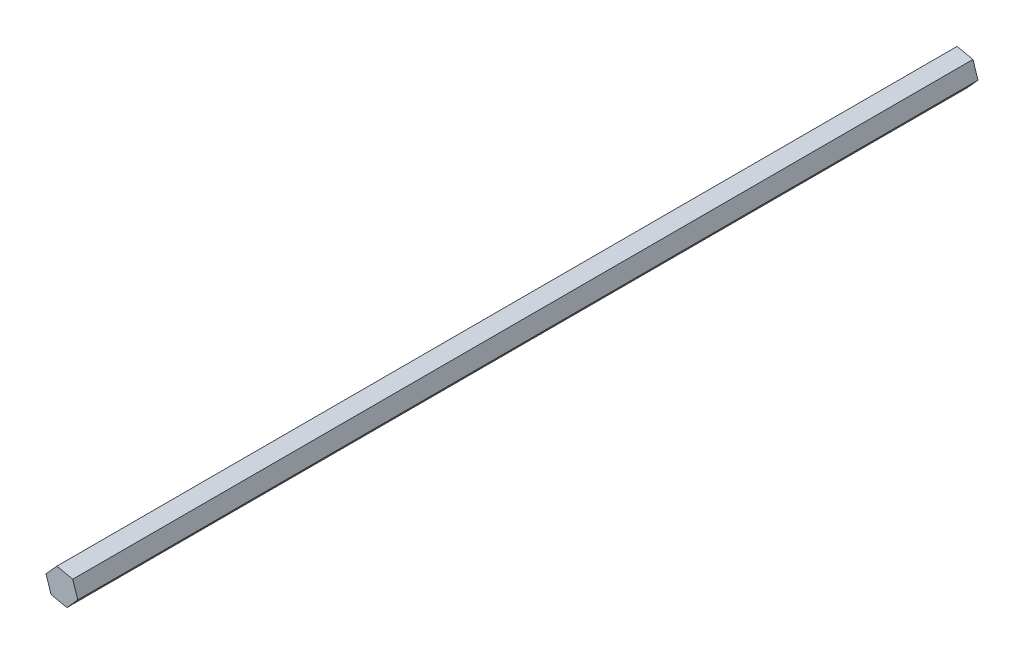
ISO-10303-21;
HEADER;
FILE_DESCRIPTION(('STEP AP214'),'2;1');
FILE_NAME('part.step','',(''),(''),'','','');
FILE_SCHEMA(('AUTOMOTIVE_DESIGN { 1 0 10303 214 1 1 1 1 }'));
ENDSEC;
DATA;
#1=APPLICATION_CONTEXT('core data for automotive mechanical design processes');
#2=APPLICATION_PROTOCOL_DEFINITION('international standard','automotive_design',2000,#1);
#3=PRODUCT_CONTEXT('',#1,'mechanical');
#4=PRODUCT('Part','Part','',(#3));
#5=PRODUCT_RELATED_PRODUCT_CATEGORY('part','',(#4));
#6=PRODUCT_DEFINITION_FORMATION('','',#4);
#7=PRODUCT_DEFINITION_CONTEXT('part definition',#1,'design');
#8=PRODUCT_DEFINITION('design','',#6,#7);
#9=PRODUCT_DEFINITION_SHAPE('','',#8);
#10=(LENGTH_UNIT() NAMED_UNIT(*) SI_UNIT(.MILLI.,.METRE.));
#11=(NAMED_UNIT(*) PLANE_ANGLE_UNIT() SI_UNIT($,.RADIAN.));
#12=(NAMED_UNIT(*) SI_UNIT($,.STERADIAN.) SOLID_ANGLE_UNIT());
#13=UNCERTAINTY_MEASURE_WITH_UNIT(LENGTH_MEASURE(1.E-05),#10,'distance_accuracy_value','');
#14=(GEOMETRIC_REPRESENTATION_CONTEXT(3) GLOBAL_UNCERTAINTY_ASSIGNED_CONTEXT((#13)) GLOBAL_UNIT_ASSIGNED_CONTEXT((#10,
#11,#12)) REPRESENTATION_CONTEXT('',''));
#15=CARTESIAN_POINT('',(0.,0.,0.));
#16=DIRECTION('',(0.,0.,1.));
#17=DIRECTION('',(1.,0.,0.));
#18=AXIS2_PLACEMENT_3D('',#15,#16,#17);
#19=CARTESIAN_POINT('',(-8.27108789893552,6.56232632795919,406.4));
#20=DIRECTION('',(-0.206984957995242,-0.978344125123521,0.));
#21=DIRECTION('',(0.978344125123521,-0.206984957995242,0.));
#22=AXIS2_PLACEMENT_3D('',#19,#20,#21);
#23=PLANE('',#22);
#24=DIRECTION('',(-0.978344125123521,0.206984957995241,0.));
#25=VECTOR('',#24,1.);
#26=CARTESIAN_POINT('',(-8.27108789893552,6.56232632795919,0.));
#27=LINE('',#26,#25);
#28=CARTESIAN_POINT('',(-8.27108789893552,6.56232632795919,0.));
#29=VERTEX_POINT('',#28);
#30=CARTESIAN_POINT('',(-15.4446478977375,8.08001215741199,0.));
#31=VERTEX_POINT('',#30);
#32=EDGE_CURVE('E128',#29,#31,#27,.T.);
#33=ORIENTED_EDGE('',*,*,#32,.T.);
#34=DIRECTION('',(0.,0.,-1.));
#35=VECTOR('',#34,1.);
#36=CARTESIAN_POINT('',(-15.4446478977375,8.08001215741199,406.4));
#37=LINE('',#36,#35);
#38=CARTESIAN_POINT('',(-15.4446478977375,8.08001215741199,406.4));
#39=VERTEX_POINT('',#38);
#40=EDGE_CURVE('E11',#39,#31,#37,.T.);
#41=ORIENTED_EDGE('',*,*,#40,.F.);
#42=DIRECTION('',(-0.978344125123521,0.206984957995241,0.));
#43=VECTOR('',#42,1.);
#44=CARTESIAN_POINT('',(-8.27108789893552,6.56232632795919,406.4));
#45=LINE('',#44,#43);
#46=CARTESIAN_POINT('',(-8.27108789893552,6.56232632795919,406.4));
#47=VERTEX_POINT('',#46);
#48=EDGE_CURVE('E144',#47,#39,#45,.T.);
#49=ORIENTED_EDGE('',*,*,#48,.F.);
#50=DIRECTION('',(0.,0.,-1.));
#51=VECTOR('',#50,1.);
#52=CARTESIAN_POINT('',(-8.27108789893552,6.56232632795919,406.4));
#53=LINE('',#52,#51);
#54=EDGE_CURVE('E124',#47,#29,#53,.T.);
#55=ORIENTED_EDGE('',*,*,#54,.T.);
#56=EDGE_LOOP('',(#33,#41,#49,#55));
#57=FACE_BOUND('',#56,.T.);
#58=ADVANCED_FACE('F39',(#57),#23,.F.);
#59=CARTESIAN_POINT('',(-15.4446478977375,8.08001215741199,406.4));
#60=DIRECTION('',(0.74377838700261,-0.668426294386894,0.));
#61=DIRECTION('',(0.668426294386894,0.74377838700261,0.));
#62=AXIS2_PLACEMENT_3D('',#59,#60,#61);
#63=PLANE('',#62);
#64=DIRECTION('',(-0.668426294386894,-0.74377838700261,0.));
#65=VECTOR('',#64,1.);
#66=CARTESIAN_POINT('',(-15.4446478977375,8.08001215741199,0.));
#67=LINE('',#66,#65);
#68=CARTESIAN_POINT('',(-20.3457823804082,2.62636987760403,0.));
#69=VERTEX_POINT('',#68);
#70=EDGE_CURVE('E132',#31,#69,#67,.T.);
#71=ORIENTED_EDGE('',*,*,#70,.T.);
#72=DIRECTION('',(0.,0.,-1.));
#73=VECTOR('',#72,1.);
#74=CARTESIAN_POINT('',(-20.3457823804082,2.62636987760403,406.4));
#75=LINE('',#74,#73);
#76=CARTESIAN_POINT('',(-20.3457823804082,2.62636987760403,406.4));
#77=VERTEX_POINT('',#76);
#78=EDGE_CURVE('E48',#77,#69,#75,.T.);
#79=ORIENTED_EDGE('',*,*,#78,.F.);
#80=DIRECTION('',(-0.668426294386894,-0.74377838700261,0.));
#81=VECTOR('',#80,1.);
#82=CARTESIAN_POINT('',(-15.4446478977375,8.08001215741199,406.4));
#83=LINE('',#82,#81);
#84=EDGE_CURVE('E93',#39,#77,#83,.T.);
#85=ORIENTED_EDGE('',*,*,#84,.F.);
#86=ORIENTED_EDGE('',*,*,#40,.T.);
#87=EDGE_LOOP('',(#71,#79,#85,#86));
#88=FACE_BOUND('',#87,.T.);
#89=ADVANCED_FACE('F172',(#88),#63,.F.);
#90=CARTESIAN_POINT('',(-20.3457823804082,2.62636987760403,406.4));
#91=DIRECTION('',(0.950763344997852,0.309917830736626,0.));
#92=DIRECTION('',(-0.309917830736627,0.950763344997852,0.));
#93=AXIS2_PLACEMENT_3D('',#90,#91,#92);
#94=PLANE('',#93);
#95=DIRECTION('',(0.309917830736627,-0.950763344997852,0.));
#96=VECTOR('',#95,1.);
#97=CARTESIAN_POINT('',(-20.3457823804082,2.62636987760403,0.));
#98=LINE('',#97,#96);
#99=CARTESIAN_POINT('',(-18.073356864277,-4.34495823165673,0.));
#100=VERTEX_POINT('',#99);
#101=EDGE_CURVE('E135',#69,#100,#98,.T.);
#102=ORIENTED_EDGE('',*,*,#101,.T.);
#103=DIRECTION('',(0.,0.,-1.));
#104=VECTOR('',#103,1.);
#105=CARTESIAN_POINT('',(-18.073356864277,-4.34495823165673,406.4));
#106=LINE('',#105,#104);
#107=CARTESIAN_POINT('',(-18.073356864277,-4.34495823165673,406.4));
#108=VERTEX_POINT('',#107);
#109=EDGE_CURVE('E117',#108,#100,#106,.T.);
#110=ORIENTED_EDGE('',*,*,#109,.F.);
#111=DIRECTION('',(0.309917830736627,-0.950763344997852,0.));
#112=VECTOR('',#111,1.);
#113=CARTESIAN_POINT('',(-20.3457823804082,2.62636987760403,406.4));
#114=LINE('',#113,#112);
#115=EDGE_CURVE('E106',#77,#108,#114,.T.);
#116=ORIENTED_EDGE('',*,*,#115,.F.);
#117=ORIENTED_EDGE('',*,*,#78,.T.);
#118=EDGE_LOOP('',(#102,#110,#116,#117));
#119=FACE_BOUND('',#118,.T.);
#120=ADVANCED_FACE('F154',(#119),#94,.F.);
#121=CARTESIAN_POINT('',(-18.073356864277,-4.34495823165673,406.4));
#122=DIRECTION('',(0.206984957995241,0.978344125123521,0.));
#123=DIRECTION('',(-0.978344125123521,0.206984957995241,0.));
#124=AXIS2_PLACEMENT_3D('',#121,#122,#123);
#125=PLANE('',#124);
#126=DIRECTION('',(0.978344125123521,-0.206984957995241,0.));
#127=VECTOR('',#126,1.);
#128=CARTESIAN_POINT('',(-18.073356864277,-4.34495823165673,0.));
#129=LINE('',#128,#127);
#130=CARTESIAN_POINT('',(-10.8997968654751,-5.86264406110953,0.));
#131=VERTEX_POINT('',#130);
#132=EDGE_CURVE('E115',#100,#131,#129,.T.);
#133=ORIENTED_EDGE('',*,*,#132,.T.);
#134=DIRECTION('',(0.,0.,-1.));
#135=VECTOR('',#134,1.);
#136=CARTESIAN_POINT('',(-10.8997968654751,-5.86264406110953,406.4));
#137=LINE('',#136,#135);
#138=CARTESIAN_POINT('',(-10.8997968654751,-5.86264406110953,406.4));
#139=VERTEX_POINT('',#138);
#140=EDGE_CURVE('E112',#139,#131,#137,.T.);
#141=ORIENTED_EDGE('',*,*,#140,.F.);
#142=DIRECTION('',(0.978344125123521,-0.206984957995241,0.));
#143=VECTOR('',#142,1.);
#144=CARTESIAN_POINT('',(-18.073356864277,-4.34495823165673,406.4));
#145=LINE('',#144,#143);
#146=EDGE_CURVE('E100',#108,#139,#145,.T.);
#147=ORIENTED_EDGE('',*,*,#146,.F.);
#148=ORIENTED_EDGE('',*,*,#109,.T.);
#149=EDGE_LOOP('',(#133,#141,#147,#148));
#150=FACE_BOUND('',#149,.T.);
#151=ADVANCED_FACE('F113',(#150),#125,.F.);
#152=CARTESIAN_POINT('',(-10.8997968654751,-5.86264406110953,406.4));
#153=DIRECTION('',(-0.74377838700261,0.668426294386894,0.));
#154=DIRECTION('',(-0.668426294386895,-0.74377838700261,0.));
#155=AXIS2_PLACEMENT_3D('',#152,#153,#154);
#156=PLANE('',#155);
#157=DIRECTION('',(0.668426294386894,0.74377838700261,0.));
#158=VECTOR('',#157,1.);
#159=CARTESIAN_POINT('',(-10.8997968654751,-5.86264406110953,0.));
#160=LINE('',#159,#158);
#161=CARTESIAN_POINT('',(-5.99866238280433,-0.40900178130157,0.));
#162=VERTEX_POINT('',#161);
#163=EDGE_CURVE('E79',#131,#162,#160,.T.);
#164=ORIENTED_EDGE('',*,*,#163,.T.);
#165=DIRECTION('',(0.,0.,-1.));
#166=VECTOR('',#165,1.);
#167=CARTESIAN_POINT('',(-5.99866238280433,-0.40900178130157,406.4));
#168=LINE('',#167,#166);
#169=CARTESIAN_POINT('',(-5.99866238280433,-0.40900178130157,406.4));
#170=VERTEX_POINT('',#169);
#171=EDGE_CURVE('E118',#170,#162,#168,.T.);
#172=ORIENTED_EDGE('',*,*,#171,.F.);
#173=DIRECTION('',(0.668426294386894,0.74377838700261,0.));
#174=VECTOR('',#173,1.);
#175=CARTESIAN_POINT('',(-10.8997968654751,-5.86264406110953,406.4));
#176=LINE('',#175,#174);
#177=EDGE_CURVE('E104',#139,#170,#176,.T.);
#178=ORIENTED_EDGE('',*,*,#177,.F.);
#179=ORIENTED_EDGE('',*,*,#140,.T.);
#180=EDGE_LOOP('',(#164,#172,#178,#179));
#181=FACE_BOUND('',#180,.T.);
#182=ADVANCED_FACE('F120',(#181),#156,.F.);
#183=CARTESIAN_POINT('',(-5.99866238280433,-0.40900178130157,406.4));
#184=DIRECTION('',(-0.950763344997852,-0.309917830736626,0.));
#185=DIRECTION('',(0.309917830736626,-0.950763344997852,0.));
#186=AXIS2_PLACEMENT_3D('',#183,#184,#185);
#187=PLANE('',#186);
#188=DIRECTION('',(-0.309917830736626,0.950763344997852,0.));
#189=VECTOR('',#188,1.);
#190=CARTESIAN_POINT('',(-5.99866238280433,-0.40900178130157,0.));
#191=LINE('',#190,#189);
#192=EDGE_CURVE('E85',#162,#29,#191,.T.);
#193=ORIENTED_EDGE('',*,*,#192,.T.);
#194=ORIENTED_EDGE('',*,*,#54,.F.);
#195=DIRECTION('',(-0.309917830736626,0.950763344997852,0.));
#196=VECTOR('',#195,1.);
#197=CARTESIAN_POINT('',(-5.99866238280433,-0.40900178130157,406.4));
#198=LINE('',#197,#196);
#199=EDGE_CURVE('E56',#170,#47,#198,.T.);
#200=ORIENTED_EDGE('',*,*,#199,.F.);
#201=ORIENTED_EDGE('',*,*,#171,.T.);
#202=EDGE_LOOP('',(#193,#194,#200,#201));
#203=FACE_BOUND('',#202,.T.);
#204=ADVANCED_FACE('F161',(#203),#187,.F.);
#205=CARTESIAN_POINT('',(0.,0.,406.4));
#206=DIRECTION('',(0.,0.,1.));
#207=DIRECTION('',(1.,0.,0.));
#208=AXIS2_PLACEMENT_3D('',#205,#206,#207);
#209=PLANE('',#208);
#210=ORIENTED_EDGE('',*,*,#48,.T.);
#211=ORIENTED_EDGE('',*,*,#84,.T.);
#212=ORIENTED_EDGE('',*,*,#115,.T.);
#213=ORIENTED_EDGE('',*,*,#146,.T.);
#214=ORIENTED_EDGE('',*,*,#177,.T.);
#215=ORIENTED_EDGE('',*,*,#199,.T.);
#216=EDGE_LOOP('',(#210,#211,#212,#213,#214,#215));
#217=FACE_BOUND('',#216,.T.);
#218=ADVANCED_FACE('F102',(#217),#209,.T.);
#219=CARTESIAN_POINT('',(0.,0.,0.));
#220=DIRECTION('',(0.,0.,1.));
#221=DIRECTION('',(1.,0.,0.));
#222=AXIS2_PLACEMENT_3D('',#219,#220,#221);
#223=PLANE('',#222);
#224=ORIENTED_EDGE('',*,*,#32,.F.);
#225=ORIENTED_EDGE('',*,*,#192,.F.);
#226=ORIENTED_EDGE('',*,*,#163,.F.);
#227=ORIENTED_EDGE('',*,*,#132,.F.);
#228=ORIENTED_EDGE('',*,*,#101,.F.);
#229=ORIENTED_EDGE('',*,*,#70,.F.);
#230=EDGE_LOOP('',(#224,#225,#226,#227,#228,#229));
#231=FACE_BOUND('',#230,.T.);
#232=ADVANCED_FACE('F157',(#231),#223,.F.);
#233=CLOSED_SHELL('',(#58,#89,#120,#151,#182,#204,#218,#232));
#234=MANIFOLD_SOLID_BREP('B2',#233);
#235=ADVANCED_BREP_SHAPE_REPRESENTATION('',(#18,#234),#14);
#236=SHAPE_DEFINITION_REPRESENTATION(#9,#235);
ENDSEC;
END-ISO-10303-21;
